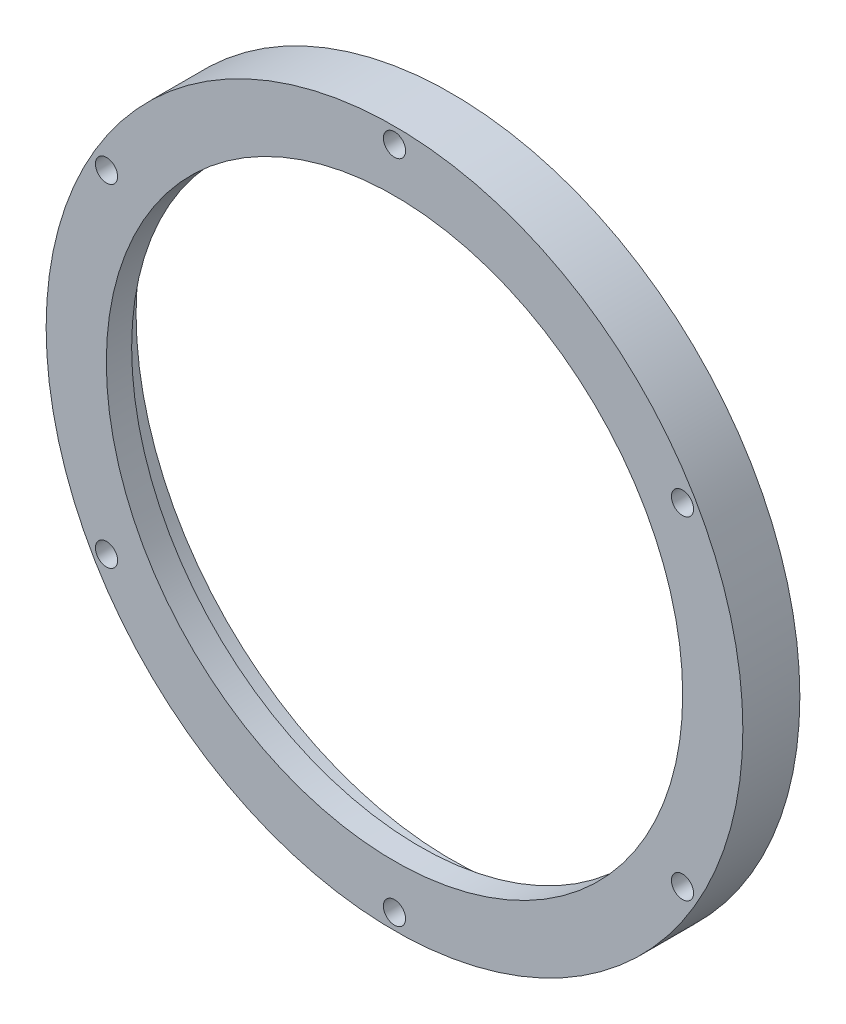
ISO-10303-21;
HEADER;
FILE_DESCRIPTION(('STEP AP214'),'2;1');
FILE_NAME('part.step','',(''),(''),'','','');
FILE_SCHEMA(('AUTOMOTIVE_DESIGN { 1 0 10303 214 1 1 1 1 }'));
ENDSEC;
DATA;
#1=APPLICATION_CONTEXT('core data for automotive mechanical design processes');
#2=APPLICATION_PROTOCOL_DEFINITION('international standard','automotive_design',2000,#1);
#3=PRODUCT_CONTEXT('',#1,'mechanical');
#4=PRODUCT('Part','Part','',(#3));
#5=PRODUCT_RELATED_PRODUCT_CATEGORY('part','',(#4));
#6=PRODUCT_DEFINITION_FORMATION('','',#4);
#7=PRODUCT_DEFINITION_CONTEXT('part definition',#1,'design');
#8=PRODUCT_DEFINITION('design','',#6,#7);
#9=PRODUCT_DEFINITION_SHAPE('','',#8);
#10=(LENGTH_UNIT() NAMED_UNIT(*) SI_UNIT(.MILLI.,.METRE.));
#11=(NAMED_UNIT(*) PLANE_ANGLE_UNIT() SI_UNIT($,.RADIAN.));
#12=(NAMED_UNIT(*) SI_UNIT($,.STERADIAN.) SOLID_ANGLE_UNIT());
#13=UNCERTAINTY_MEASURE_WITH_UNIT(LENGTH_MEASURE(1.E-05),#10,'distance_accuracy_value','');
#14=(GEOMETRIC_REPRESENTATION_CONTEXT(3) GLOBAL_UNCERTAINTY_ASSIGNED_CONTEXT((#13)) GLOBAL_UNIT_ASSIGNED_CONTEXT((#10,
#11,#12)) REPRESENTATION_CONTEXT('',''));
#15=CARTESIAN_POINT('',(0.,0.,0.));
#16=DIRECTION('',(0.,0.,1.));
#17=DIRECTION('',(1.,0.,0.));
#18=AXIS2_PLACEMENT_3D('',#15,#16,#17);
#19=CARTESIAN_POINT('',(0.,0.,9.));
#20=DIRECTION('',(0.,0.,1.));
#21=DIRECTION('',(1.,0.,0.));
#22=AXIS2_PLACEMENT_3D('',#19,#20,#21);
#23=PLANE('',#22);
#24=CARTESIAN_POINT('',(-45.4663336986827,26.2500000000005,9.));
#25=DIRECTION('',(0.,0.,1.));
#26=DIRECTION('',(0.50000000000001,0.866025403784433,0.));
#27=AXIS2_PLACEMENT_3D('',#24,#25,#26);
#28=CIRCLE('',#27,1.75);
#29=CARTESIAN_POINT('',(-44.5913336986827,27.7655444566233,9.));
#30=VERTEX_POINT('',#29);
#31=EDGE_CURVE('E59',#30,#30,#28,.T.);
#32=ORIENTED_EDGE('',*,*,#31,.F.);
#33=EDGE_LOOP('',(#32));
#34=FACE_BOUND('',#33,.T.);
#35=CARTESIAN_POINT('',(-45.4663336986833,-26.2499999999996,9.));
#36=DIRECTION('',(0.,0.,1.));
#37=DIRECTION('',(-0.499999999999992,0.866025403784443,0.));
#38=AXIS2_PLACEMENT_3D('',#35,#36,#37);
#39=CIRCLE('',#38,1.75);
#40=CARTESIAN_POINT('',(-46.3413336986833,-24.7344555433768,9.));
#41=VERTEX_POINT('',#40);
#42=EDGE_CURVE('E66',#41,#41,#39,.T.);
#43=ORIENTED_EDGE('',*,*,#42,.F.);
#44=EDGE_LOOP('',(#43));
#45=FACE_BOUND('',#44,.T.);
#46=CARTESIAN_POINT('',(0.,-52.5,9.));
#47=DIRECTION('',(0.,0.,1.));
#48=DIRECTION('',(-1.,0.,0.));
#49=AXIS2_PLACEMENT_3D('',#46,#47,#48);
#50=CIRCLE('',#49,1.75);
#51=CARTESIAN_POINT('',(-1.75,-52.5,9.));
#52=VERTEX_POINT('',#51);
#53=EDGE_CURVE('E72',#52,#52,#50,.T.);
#54=ORIENTED_EDGE('',*,*,#53,.F.);
#55=EDGE_LOOP('',(#54));
#56=FACE_BOUND('',#55,.T.);
#57=CARTESIAN_POINT('',(45.4663336986829,-26.2500000000002,9.));
#58=DIRECTION('',(0.,0.,1.));
#59=DIRECTION('',(-0.500000000000004,-0.866025403784436,0.));
#60=AXIS2_PLACEMENT_3D('',#57,#58,#59);
#61=CIRCLE('',#60,1.75);
#62=CARTESIAN_POINT('',(44.5913336986829,-27.765544456623,9.));
#63=VERTEX_POINT('',#62);
#64=EDGE_CURVE('E78',#63,#63,#61,.T.);
#65=ORIENTED_EDGE('',*,*,#64,.F.);
#66=EDGE_LOOP('',(#65));
#67=FACE_BOUND('',#66,.T.);
#68=CARTESIAN_POINT('',(45.4663336986831,26.2499999999999,9.));
#69=DIRECTION('',(0.,0.,1.));
#70=DIRECTION('',(0.499999999999998,-0.86602540378444,0.));
#71=AXIS2_PLACEMENT_3D('',#68,#69,#70);
#72=CIRCLE('',#71,1.75);
#73=CARTESIAN_POINT('',(46.3413336986831,24.7344555433771,9.));
#74=VERTEX_POINT('',#73);
#75=EDGE_CURVE('E53',#74,#74,#72,.T.);
#76=ORIENTED_EDGE('',*,*,#75,.F.);
#77=EDGE_LOOP('',(#76));
#78=FACE_BOUND('',#77,.T.);
#79=CARTESIAN_POINT('',(0.,52.5,9.));
#80=DIRECTION('',(0.,0.,1.));
#81=DIRECTION('',(1.,0.,0.));
#82=AXIS2_PLACEMENT_3D('',#79,#80,#81);
#83=CIRCLE('',#82,1.75);
#84=CARTESIAN_POINT('',(1.75,52.5,9.));
#85=VERTEX_POINT('',#84);
#86=EDGE_CURVE('E47',#85,#85,#83,.T.);
#87=ORIENTED_EDGE('',*,*,#86,.F.);
#88=EDGE_LOOP('',(#87));
#89=FACE_BOUND('',#88,.T.);
#90=CARTESIAN_POINT('',(0.,0.,9.));
#91=DIRECTION('',(0.,0.,1.));
#92=DIRECTION('',(1.,0.,0.));
#93=AXIS2_PLACEMENT_3D('',#90,#91,#92);
#94=CIRCLE('',#93,55.);
#95=CARTESIAN_POINT('',(55.,0.,9.));
#96=VERTEX_POINT('',#95);
#97=EDGE_CURVE('E10',#96,#96,#94,.T.);
#98=ORIENTED_EDGE('',*,*,#97,.T.);
#99=EDGE_LOOP('',(#98));
#100=FACE_BOUND('',#99,.T.);
#101=CARTESIAN_POINT('',(0.,0.,9.));
#102=DIRECTION('',(0.,0.,1.));
#103=DIRECTION('',(1.,0.,0.));
#104=AXIS2_PLACEMENT_3D('',#101,#102,#103);
#105=CIRCLE('',#104,45.5);
#106=CARTESIAN_POINT('',(45.5,0.,9.));
#107=VERTEX_POINT('',#106);
#108=EDGE_CURVE('E42',#107,#107,#105,.T.);
#109=ORIENTED_EDGE('',*,*,#108,.F.);
#110=EDGE_LOOP('',(#109));
#111=FACE_BOUND('',#110,.T.);
#112=ADVANCED_FACE('F31',(#34,#45,#56,#67,#78,#89,#100,#111),#23,.T.);
#113=CARTESIAN_POINT('',(0.,0.,0.));
#114=DIRECTION('',(0.,0.,1.));
#115=DIRECTION('',(1.,0.,0.));
#116=AXIS2_PLACEMENT_3D('',#113,#114,#115);
#117=PLANE('',#116);
#118=CARTESIAN_POINT('',(0.,0.,0.));
#119=DIRECTION('',(0.,0.,-1.));
#120=DIRECTION('',(-1.,0.,0.));
#121=AXIS2_PLACEMENT_3D('',#118,#119,#120);
#122=CIRCLE('',#121,49.8);
#123=CARTESIAN_POINT('',(-49.8,0.,0.));
#124=VERTEX_POINT('',#123);
#125=EDGE_CURVE('E63',#124,#124,#122,.T.);
#126=ORIENTED_EDGE('',*,*,#125,.F.);
#127=EDGE_LOOP('',(#126));
#128=FACE_BOUND('',#127,.T.);
#129=CARTESIAN_POINT('',(-45.4663336986827,26.2500000000005,0.));
#130=DIRECTION('',(0.,0.,1.));
#131=DIRECTION('',(0.50000000000001,0.866025403784433,0.));
#132=AXIS2_PLACEMENT_3D('',#129,#130,#131);
#133=CIRCLE('',#132,1.75);
#134=CARTESIAN_POINT('',(-44.5913336986827,27.7655444566233,0.));
#135=VERTEX_POINT('',#134);
#136=EDGE_CURVE('E62',#135,#135,#133,.T.);
#137=ORIENTED_EDGE('',*,*,#136,.T.);
#138=EDGE_LOOP('',(#137));
#139=FACE_BOUND('',#138,.T.);
#140=CARTESIAN_POINT('',(-45.4663336986833,-26.2499999999996,0.));
#141=DIRECTION('',(0.,0.,1.));
#142=DIRECTION('',(-0.499999999999992,0.866025403784443,0.));
#143=AXIS2_PLACEMENT_3D('',#140,#141,#142);
#144=CIRCLE('',#143,1.75);
#145=CARTESIAN_POINT('',(-46.3413336986833,-24.7344555433768,0.));
#146=VERTEX_POINT('',#145);
#147=EDGE_CURVE('E69',#146,#146,#144,.T.);
#148=ORIENTED_EDGE('',*,*,#147,.T.);
#149=EDGE_LOOP('',(#148));
#150=FACE_BOUND('',#149,.T.);
#151=CARTESIAN_POINT('',(0.,-52.5,0.));
#152=DIRECTION('',(0.,0.,1.));
#153=DIRECTION('',(-1.,0.,0.));
#154=AXIS2_PLACEMENT_3D('',#151,#152,#153);
#155=CIRCLE('',#154,1.75);
#156=CARTESIAN_POINT('',(-1.75,-52.5,0.));
#157=VERTEX_POINT('',#156);
#158=EDGE_CURVE('E75',#157,#157,#155,.T.);
#159=ORIENTED_EDGE('',*,*,#158,.T.);
#160=EDGE_LOOP('',(#159));
#161=FACE_BOUND('',#160,.T.);
#162=CARTESIAN_POINT('',(45.4663336986829,-26.2500000000002,0.));
#163=DIRECTION('',(0.,0.,1.));
#164=DIRECTION('',(-0.500000000000004,-0.866025403784436,0.));
#165=AXIS2_PLACEMENT_3D('',#162,#163,#164);
#166=CIRCLE('',#165,1.75);
#167=CARTESIAN_POINT('',(44.5913336986829,-27.765544456623,0.));
#168=VERTEX_POINT('',#167);
#169=EDGE_CURVE('E56',#168,#168,#166,.T.);
#170=ORIENTED_EDGE('',*,*,#169,.T.);
#171=EDGE_LOOP('',(#170));
#172=FACE_BOUND('',#171,.T.);
#173=CARTESIAN_POINT('',(45.4663336986831,26.2499999999999,0.));
#174=DIRECTION('',(0.,0.,1.));
#175=DIRECTION('',(0.499999999999998,-0.86602540378444,0.));
#176=AXIS2_PLACEMENT_3D('',#173,#174,#175);
#177=CIRCLE('',#176,1.75);
#178=CARTESIAN_POINT('',(46.3413336986831,24.7344555433771,0.));
#179=VERTEX_POINT('',#178);
#180=EDGE_CURVE('E50',#179,#179,#177,.T.);
#181=ORIENTED_EDGE('',*,*,#180,.T.);
#182=EDGE_LOOP('',(#181));
#183=FACE_BOUND('',#182,.T.);
#184=CARTESIAN_POINT('',(0.,52.5,0.));
#185=DIRECTION('',(0.,0.,1.));
#186=DIRECTION('',(1.,0.,0.));
#187=AXIS2_PLACEMENT_3D('',#184,#185,#186);
#188=CIRCLE('',#187,1.75);
#189=CARTESIAN_POINT('',(1.75,52.5,0.));
#190=VERTEX_POINT('',#189);
#191=EDGE_CURVE('E46',#190,#190,#188,.T.);
#192=ORIENTED_EDGE('',*,*,#191,.T.);
#193=EDGE_LOOP('',(#192));
#194=FACE_BOUND('',#193,.T.);
#195=CARTESIAN_POINT('',(0.,0.,0.));
#196=DIRECTION('',(0.,0.,1.));
#197=DIRECTION('',(1.,0.,0.));
#198=AXIS2_PLACEMENT_3D('',#195,#196,#197);
#199=CIRCLE('',#198,55.);
#200=CARTESIAN_POINT('',(55.,0.,0.));
#201=VERTEX_POINT('',#200);
#202=EDGE_CURVE('E35',#201,#201,#199,.T.);
#203=ORIENTED_EDGE('',*,*,#202,.F.);
#204=EDGE_LOOP('',(#203));
#205=FACE_BOUND('',#204,.T.);
#206=ADVANCED_FACE('F108',(#128,#139,#150,#161,#172,#183,#194,#205),#117,.F.);
#207=CARTESIAN_POINT('',(0.,0.,9.));
#208=DIRECTION('',(0.,0.,-1.));
#209=DIRECTION('',(-1.,0.,0.));
#210=AXIS2_PLACEMENT_3D('',#207,#208,#209);
#211=CYLINDRICAL_SURFACE('',#210,55.);
#212=ORIENTED_EDGE('',*,*,#97,.F.);
#213=EDGE_LOOP('',(#212));
#214=FACE_BOUND('',#213,.T.);
#215=ORIENTED_EDGE('',*,*,#202,.T.);
#216=EDGE_LOOP('',(#215));
#217=FACE_BOUND('',#216,.T.);
#218=ADVANCED_FACE('F33',(#214,#217),#211,.T.);
#219=CARTESIAN_POINT('',(0.,0.,9.));
#220=DIRECTION('',(0.,0.,-1.));
#221=DIRECTION('',(-1.,0.,0.));
#222=AXIS2_PLACEMENT_3D('',#219,#220,#221);
#223=CYLINDRICAL_SURFACE('',#222,45.5);
#224=CARTESIAN_POINT('',(0.,0.,5.));
#225=DIRECTION('',(0.,0.,-1.));
#226=DIRECTION('',(-1.,0.,0.));
#227=AXIS2_PLACEMENT_3D('',#224,#225,#226);
#228=CIRCLE('',#227,45.5);
#229=CARTESIAN_POINT('',(-45.5,0.,5.));
#230=VERTEX_POINT('',#229);
#231=EDGE_CURVE('E88',#230,#230,#228,.T.);
#232=ORIENTED_EDGE('',*,*,#231,.T.);
#233=EDGE_LOOP('',(#232));
#234=FACE_BOUND('',#233,.T.);
#235=ORIENTED_EDGE('',*,*,#108,.T.);
#236=EDGE_LOOP('',(#235));
#237=FACE_BOUND('',#236,.T.);
#238=ADVANCED_FACE('F92',(#234,#237),#223,.F.);
#239=CARTESIAN_POINT('',(0.,52.5,0.));
#240=DIRECTION('',(0.,0.,1.));
#241=DIRECTION('',(1.,0.,0.));
#242=AXIS2_PLACEMENT_3D('',#239,#240,#241);
#243=CYLINDRICAL_SURFACE('',#242,1.75);
#244=ORIENTED_EDGE('',*,*,#191,.F.);
#245=EDGE_LOOP('',(#244));
#246=FACE_BOUND('',#245,.T.);
#247=ORIENTED_EDGE('',*,*,#86,.T.);
#248=EDGE_LOOP('',(#247));
#249=FACE_BOUND('',#248,.T.);
#250=ADVANCED_FACE('F130',(#246,#249),#243,.F.);
#251=CARTESIAN_POINT('',(45.4663336986831,26.2499999999999,0.));
#252=DIRECTION('',(0.,0.,1.));
#253=DIRECTION('',(1.,0.,0.));
#254=AXIS2_PLACEMENT_3D('',#251,#252,#253);
#255=CYLINDRICAL_SURFACE('',#254,1.75);
#256=ORIENTED_EDGE('',*,*,#180,.F.);
#257=EDGE_LOOP('',(#256));
#258=FACE_BOUND('',#257,.T.);
#259=ORIENTED_EDGE('',*,*,#75,.T.);
#260=EDGE_LOOP('',(#259));
#261=FACE_BOUND('',#260,.T.);
#262=ADVANCED_FACE('F142',(#258,#261),#255,.F.);
#263=CARTESIAN_POINT('',(45.4663336986829,-26.2500000000002,0.));
#264=DIRECTION('',(0.,0.,1.));
#265=DIRECTION('',(1.,0.,0.));
#266=AXIS2_PLACEMENT_3D('',#263,#264,#265);
#267=CYLINDRICAL_SURFACE('',#266,1.75);
#268=ORIENTED_EDGE('',*,*,#169,.F.);
#269=EDGE_LOOP('',(#268));
#270=FACE_BOUND('',#269,.T.);
#271=ORIENTED_EDGE('',*,*,#64,.T.);
#272=EDGE_LOOP('',(#271));
#273=FACE_BOUND('',#272,.T.);
#274=ADVANCED_FACE('F146',(#270,#273),#267,.F.);
#275=CARTESIAN_POINT('',(0.,-52.5,0.));
#276=DIRECTION('',(0.,0.,1.));
#277=DIRECTION('',(1.,0.,0.));
#278=AXIS2_PLACEMENT_3D('',#275,#276,#277);
#279=CYLINDRICAL_SURFACE('',#278,1.75);
#280=ORIENTED_EDGE('',*,*,#158,.F.);
#281=EDGE_LOOP('',(#280));
#282=FACE_BOUND('',#281,.T.);
#283=ORIENTED_EDGE('',*,*,#53,.T.);
#284=EDGE_LOOP('',(#283));
#285=FACE_BOUND('',#284,.T.);
#286=ADVANCED_FACE('F154',(#282,#285),#279,.F.);
#287=CARTESIAN_POINT('',(-45.4663336986833,-26.2499999999996,0.));
#288=DIRECTION('',(0.,0.,1.));
#289=DIRECTION('',(1.,0.,0.));
#290=AXIS2_PLACEMENT_3D('',#287,#288,#289);
#291=CYLINDRICAL_SURFACE('',#290,1.75);
#292=ORIENTED_EDGE('',*,*,#147,.F.);
#293=EDGE_LOOP('',(#292));
#294=FACE_BOUND('',#293,.T.);
#295=ORIENTED_EDGE('',*,*,#42,.T.);
#296=EDGE_LOOP('',(#295));
#297=FACE_BOUND('',#296,.T.);
#298=ADVANCED_FACE('F150',(#294,#297),#291,.F.);
#299=CARTESIAN_POINT('',(-45.4663336986827,26.2500000000005,0.));
#300=DIRECTION('',(0.,0.,1.));
#301=DIRECTION('',(1.,0.,0.));
#302=AXIS2_PLACEMENT_3D('',#299,#300,#301);
#303=CYLINDRICAL_SURFACE('',#302,1.75);
#304=ORIENTED_EDGE('',*,*,#136,.F.);
#305=EDGE_LOOP('',(#304));
#306=FACE_BOUND('',#305,.T.);
#307=ORIENTED_EDGE('',*,*,#31,.T.);
#308=EDGE_LOOP('',(#307));
#309=FACE_BOUND('',#308,.T.);
#310=ADVANCED_FACE('F104',(#306,#309),#303,.F.);
#311=CARTESIAN_POINT('',(0.,0.,0.));
#312=DIRECTION('',(0.,0.,-1.));
#313=DIRECTION('',(-1.,0.,0.));
#314=AXIS2_PLACEMENT_3D('',#311,#312,#313);
#315=CYLINDRICAL_SURFACE('',#314,49.8);
#316=CARTESIAN_POINT('',(0.,0.,5.));
#317=DIRECTION('',(0.,0.,-1.));
#318=DIRECTION('',(-1.,0.,0.));
#319=AXIS2_PLACEMENT_3D('',#316,#317,#318);
#320=CIRCLE('',#319,49.8);
#321=CARTESIAN_POINT('',(-49.8,0.,5.));
#322=VERTEX_POINT('',#321);
#323=EDGE_CURVE('E85',#322,#322,#320,.T.);
#324=ORIENTED_EDGE('',*,*,#323,.F.);
#325=EDGE_LOOP('',(#324));
#326=FACE_BOUND('',#325,.T.);
#327=ORIENTED_EDGE('',*,*,#125,.T.);
#328=EDGE_LOOP('',(#327));
#329=FACE_BOUND('',#328,.T.);
#330=ADVANCED_FACE('F98',(#326,#329),#315,.F.);
#331=CARTESIAN_POINT('',(-46.8307282196731,0.,5.));
#332=DIRECTION('',(0.,0.,1.));
#333=DIRECTION('',(1.,0.,0.));
#334=AXIS2_PLACEMENT_3D('',#331,#332,#333);
#335=PLANE('',#334);
#336=ORIENTED_EDGE('',*,*,#231,.F.);
#337=EDGE_LOOP('',(#336));
#338=FACE_BOUND('',#337,.T.);
#339=ORIENTED_EDGE('',*,*,#323,.T.);
#340=EDGE_LOOP('',(#339));
#341=FACE_BOUND('',#340,.T.);
#342=ADVANCED_FACE('F95',(#338,#341),#335,.F.);
#343=CLOSED_SHELL('',(#112,#206,#218,#238,#250,#262,#274,#286,#298,#310,#330,#342));
#344=MANIFOLD_SOLID_BREP('B2',#343);
#345=ADVANCED_BREP_SHAPE_REPRESENTATION('',(#18,#344),#14);
#346=SHAPE_DEFINITION_REPRESENTATION(#9,#345);
ENDSEC;
END-ISO-10303-21;
